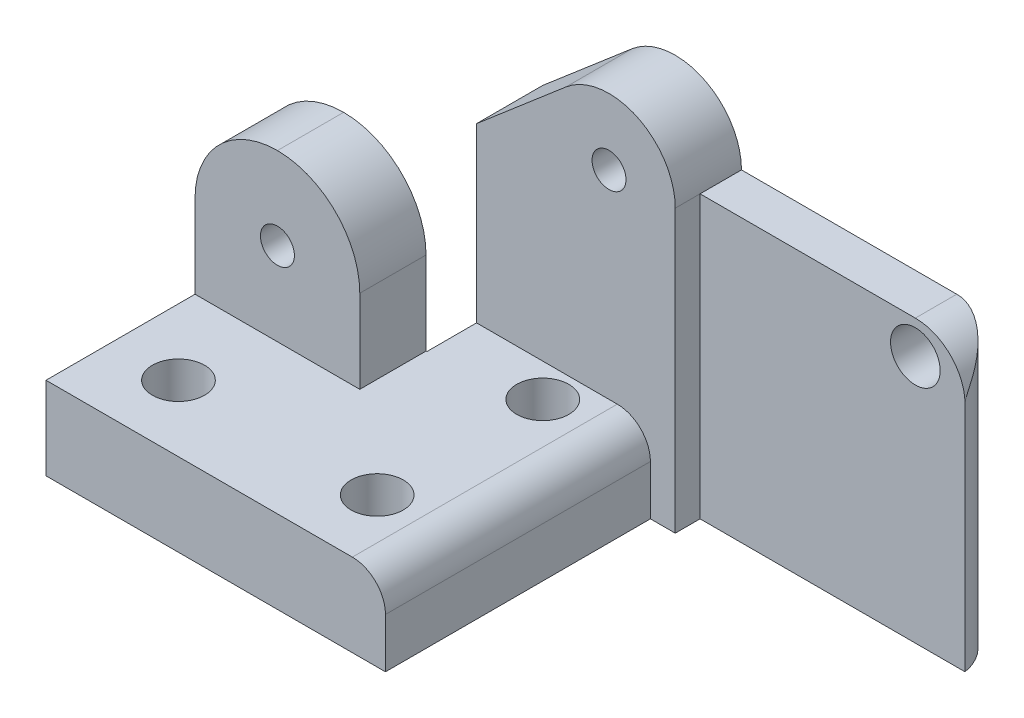
ISO-10303-21;
HEADER;
FILE_DESCRIPTION(('STEP AP214'),'2;1');
FILE_NAME('part.step','',(''),(''),'','','');
FILE_SCHEMA(('AUTOMOTIVE_DESIGN { 1 0 10303 214 1 1 1 1 }'));
ENDSEC;
DATA;
#1=APPLICATION_CONTEXT('core data for automotive mechanical design processes');
#2=APPLICATION_PROTOCOL_DEFINITION('international standard','automotive_design',2000,#1);
#3=PRODUCT_CONTEXT('',#1,'mechanical');
#4=PRODUCT('Part','Part','',(#3));
#5=PRODUCT_RELATED_PRODUCT_CATEGORY('part','',(#4));
#6=PRODUCT_DEFINITION_FORMATION('','',#4);
#7=PRODUCT_DEFINITION_CONTEXT('part definition',#1,'design');
#8=PRODUCT_DEFINITION('design','',#6,#7);
#9=PRODUCT_DEFINITION_SHAPE('','',#8);
#10=(LENGTH_UNIT() NAMED_UNIT(*) SI_UNIT(.MILLI.,.METRE.));
#11=(NAMED_UNIT(*) PLANE_ANGLE_UNIT() SI_UNIT($,.RADIAN.));
#12=(NAMED_UNIT(*) SI_UNIT($,.STERADIAN.) SOLID_ANGLE_UNIT());
#13=UNCERTAINTY_MEASURE_WITH_UNIT(LENGTH_MEASURE(1.E-05),#10,'distance_accuracy_value','');
#14=(GEOMETRIC_REPRESENTATION_CONTEXT(3) GLOBAL_UNCERTAINTY_ASSIGNED_CONTEXT((#13)) GLOBAL_UNIT_ASSIGNED_CONTEXT((#10,
#11,#12)) REPRESENTATION_CONTEXT('',''));
#15=CARTESIAN_POINT('',(0.,0.,0.));
#16=DIRECTION('',(0.,0.,1.));
#17=DIRECTION('',(1.,0.,0.));
#18=AXIS2_PLACEMENT_3D('',#15,#16,#17);
#19=CARTESIAN_POINT('',(16.,17.,-20.));
#20=DIRECTION('',(-1.,0.,0.));
#21=DIRECTION('',(0.,0.,-1.));
#22=AXIS2_PLACEMENT_3D('',#19,#20,#21);
#23=PLANE('',#22);
#24=DIRECTION('',(0.,1.,0.));
#25=VECTOR('',#24,1.);
#26=CARTESIAN_POINT('',(16.,0.,-17.5));
#27=LINE('',#26,#25);
#28=CARTESIAN_POINT('',(16.,0.,-17.5));
#29=VERTEX_POINT('',#28);
#30=CARTESIAN_POINT('',(16.,17.,-17.5));
#31=VERTEX_POINT('',#30);
#32=EDGE_CURVE('E211',#29,#31,#27,.T.);
#33=ORIENTED_EDGE('',*,*,#32,.T.);
#34=DIRECTION('',(0.,0.,1.));
#35=VECTOR('',#34,1.);
#36=CARTESIAN_POINT('',(16.,17.,-20.));
#37=LINE('',#36,#35);
#38=CARTESIAN_POINT('',(16.,17.,-16.));
#39=VERTEX_POINT('',#38);
#40=EDGE_CURVE('E444',#31,#39,#37,.T.);
#41=ORIENTED_EDGE('',*,*,#40,.T.);
#42=DIRECTION('',(0.,-1.,0.));
#43=VECTOR('',#42,1.);
#44=CARTESIAN_POINT('',(16.,5.,-16.));
#45=LINE('',#44,#43);
#46=CARTESIAN_POINT('',(16.,0.,-16.));
#47=VERTEX_POINT('',#46);
#48=EDGE_CURVE('E418',#39,#47,#45,.T.);
#49=ORIENTED_EDGE('',*,*,#48,.T.);
#50=DIRECTION('',(0.,0.,1.));
#51=VECTOR('',#50,1.);
#52=CARTESIAN_POINT('',(16.,0.,-20.));
#53=LINE('',#52,#51);
#54=EDGE_CURVE('E448',#29,#47,#53,.T.);
#55=ORIENTED_EDGE('',*,*,#54,.F.);
#56=EDGE_LOOP('',(#33,#41,#49,#55));
#57=FACE_BOUND('',#56,.T.);
#58=ADVANCED_FACE('F43',(#57),#23,.F.);
#59=CARTESIAN_POINT('',(12.,17.,-20.));
#60=DIRECTION('',(0.,0.,1.));
#61=DIRECTION('',(-1.,0.,0.));
#62=AXIS2_PLACEMENT_3D('',#59,#60,#61);
#63=PLANE('',#62);
#64=DIRECTION('',(0.,1.,0.));
#65=VECTOR('',#64,1.);
#66=CARTESIAN_POINT('',(29.0419601084502,17.,-20.));
#67=LINE('',#66,#65);
#68=CARTESIAN_POINT('',(29.0419601084502,0.,-20.));
#69=VERTEX_POINT('',#68);
#70=CARTESIAN_POINT('',(29.0419601084502,13.5005869984228,-20.));
#71=VERTEX_POINT('',#70);
#72=EDGE_CURVE('E184',#69,#71,#67,.T.);
#73=ORIENTED_EDGE('',*,*,#72,.F.);
#74=DIRECTION('',(1.,0.,0.));
#75=VECTOR('',#74,1.);
#76=CARTESIAN_POINT('',(16.,0.,-20.));
#77=LINE('',#76,#75);
#78=CARTESIAN_POINT('',(4.,0.,-20.));
#79=VERTEX_POINT('',#78);
#80=EDGE_CURVE('E430',#79,#69,#77,.T.);
#81=ORIENTED_EDGE('',*,*,#80,.F.);
#82=DIRECTION('',(0.,1.,0.));
#83=VECTOR('',#82,1.);
#84=CARTESIAN_POINT('',(4.,0.,-20.));
#85=LINE('',#84,#83);
#86=CARTESIAN_POINT('',(4.,15.4211646096066,-20.));
#87=VERTEX_POINT('',#86);
#88=EDGE_CURVE('E408',#79,#87,#85,.T.);
#89=ORIENTED_EDGE('',*,*,#88,.T.);
#90=DIRECTION('',(-0.759951494214413,-0.649979789256005,0.));
#91=VECTOR('',#90,1.);
#92=CARTESIAN_POINT('',(0.,12.,-20.));
#93=LINE('',#92,#91);
#94=CARTESIAN_POINT('',(9.40008084297598,20.0398059768577,-20.));
#95=VERTEX_POINT('',#94);
#96=EDGE_CURVE('E436',#95,#87,#93,.T.);
#97=ORIENTED_EDGE('',*,*,#96,.F.);
#98=CARTESIAN_POINT('',(12.,17.,-20.));
#99=DIRECTION('',(0.,0.,1.));
#100=DIRECTION('',(-1.,0.,0.));
#101=AXIS2_PLACEMENT_3D('',#98,#99,#100);
#102=CIRCLE('',#101,4.);
#103=CARTESIAN_POINT('',(16.,17.,-20.));
#104=VERTEX_POINT('',#103);
#105=EDGE_CURVE('E433',#104,#95,#102,.T.);
#106=ORIENTED_EDGE('',*,*,#105,.F.);
#107=DIRECTION('',(-1.,0.,0.));
#108=VECTOR('',#107,1.);
#109=CARTESIAN_POINT('',(32.,17.,-20.));
#110=LINE('',#109,#108);
#111=CARTESIAN_POINT('',(29.,17.,-20.));
#112=VERTEX_POINT('',#111);
#113=EDGE_CURVE('E325',#112,#104,#110,.T.);
#114=ORIENTED_EDGE('',*,*,#113,.F.);
#115=CARTESIAN_POINT('',(29.,14.,-20.));
#116=DIRECTION('',(0.,0.,-1.));
#117=DIRECTION('',(-1.,0.,0.));
#118=AXIS2_PLACEMENT_3D('',#115,#116,#117);
#119=CIRCLE('',#118,3.);
#120=CARTESIAN_POINT('',(29.0419601084502,16.9997065438637,-20.));
#121=VERTEX_POINT('',#120);
#122=EDGE_CURVE('E195',#121,#112,#119,.F.);
#123=ORIENTED_EDGE('',*,*,#122,.F.);
#124=CARTESIAN_POINT('',(29.0419601084502,16.4994130015772,-20.));
#125=VERTEX_POINT('',#124);
#126=EDGE_CURVE('E181',#125,#121,#67,.T.);
#127=ORIENTED_EDGE('',*,*,#126,.F.);
#128=CARTESIAN_POINT('',(29.,15.,-20.));
#129=DIRECTION('',(0.,0.,1.));
#130=DIRECTION('',(1.,0.,0.));
#131=AXIS2_PLACEMENT_3D('',#128,#129,#130);
#132=CIRCLE('',#131,1.5);
#133=EDGE_CURVE('E185',#125,#71,#132,.T.);
#134=ORIENTED_EDGE('',*,*,#133,.T.);
#135=EDGE_LOOP('',(#73,#81,#89,#97,#106,#114,#123,#127,#134));
#136=FACE_BOUND('',#135,.T.);
#137=CARTESIAN_POINT('',(12.,17.,-20.));
#138=DIRECTION('',(0.,0.,1.));
#139=DIRECTION('',(1.,0.,0.));
#140=AXIS2_PLACEMENT_3D('',#137,#138,#139);
#141=CIRCLE('',#140,1.025);
#142=CARTESIAN_POINT('',(13.025,17.,-20.));
#143=VERTEX_POINT('',#142);
#144=EDGE_CURVE('E336',#143,#143,#141,.T.);
#145=ORIENTED_EDGE('',*,*,#144,.T.);
#146=EDGE_LOOP('',(#145));
#147=FACE_BOUND('',#146,.T.);
#148=ADVANCED_FACE('F191',(#136,#147),#63,.F.);
#149=CARTESIAN_POINT('',(-6.,5.,-13.));
#150=DIRECTION('',(0.,0.,1.));
#151=DIRECTION('',(-1.,0.,0.));
#152=AXIS2_PLACEMENT_3D('',#149,#150,#151);
#153=PLANE('',#152);
#154=DIRECTION('',(0.,-1.,0.));
#155=VECTOR('',#154,1.);
#156=CARTESIAN_POINT('',(3.95,15.,-13.));
#157=LINE('',#156,#155);
#158=CARTESIAN_POINT('',(3.95,10.025,-13.));
#159=VERTEX_POINT('',#158);
#160=CARTESIAN_POINT('',(3.95,5.,-13.));
#161=VERTEX_POINT('',#160);
#162=EDGE_CURVE('E370',#159,#161,#157,.T.);
#163=ORIENTED_EDGE('',*,*,#162,.T.);
#164=DIRECTION('',(1.,0.,0.));
#165=VECTOR('',#164,1.);
#166=CARTESIAN_POINT('',(-6.,5.,-13.));
#167=LINE('',#166,#165);
#168=CARTESIAN_POINT('',(4.,5.,-13.));
#169=VERTEX_POINT('',#168);
#170=EDGE_CURVE('E400',#161,#169,#167,.T.);
#171=ORIENTED_EDGE('',*,*,#170,.T.);
#172=DIRECTION('',(0.,1.,0.));
#173=VECTOR('',#172,1.);
#174=CARTESIAN_POINT('',(4.,5.,-13.));
#175=LINE('',#174,#173);
#176=CARTESIAN_POINT('',(4.,0.,-13.));
#177=VERTEX_POINT('',#176);
#178=EDGE_CURVE('E389',#177,#169,#175,.T.);
#179=ORIENTED_EDGE('',*,*,#178,.F.);
#180=DIRECTION('',(1.,0.,0.));
#181=VECTOR('',#180,1.);
#182=CARTESIAN_POINT('',(-6.,0.,-13.));
#183=LINE('',#182,#181);
#184=CARTESIAN_POINT('',(-6.,0.,-13.));
#185=VERTEX_POINT('',#184);
#186=EDGE_CURVE('E405',#185,#177,#183,.T.);
#187=ORIENTED_EDGE('',*,*,#186,.F.);
#188=DIRECTION('',(0.,1.,0.));
#189=VECTOR('',#188,1.);
#190=CARTESIAN_POINT('',(-6.,5.,-13.));
#191=LINE('',#190,#189);
#192=CARTESIAN_POINT('',(-6.,10.025,-13.));
#193=VERTEX_POINT('',#192);
#194=EDGE_CURVE('E394',#185,#193,#191,.T.);
#195=ORIENTED_EDGE('',*,*,#194,.T.);
#196=CARTESIAN_POINT('',(-1.025,10.025,-13.));
#197=DIRECTION('',(0.,0.,-1.));
#198=DIRECTION('',(-1.,0.,0.));
#199=AXIS2_PLACEMENT_3D('',#196,#197,#198);
#200=CIRCLE('',#199,4.975);
#201=CARTESIAN_POINT('',(-1.025,15.,-13.));
#202=VERTEX_POINT('',#201);
#203=EDGE_CURVE('E466',#202,#193,#200,.F.);
#204=ORIENTED_EDGE('',*,*,#203,.F.);
#205=CARTESIAN_POINT('',(-1.025,10.025,-13.));
#206=DIRECTION('',(0.,0.,-1.));
#207=DIRECTION('',(-1.,0.,0.));
#208=AXIS2_PLACEMENT_3D('',#205,#206,#207);
#209=CIRCLE('',#208,4.975);
#210=EDGE_CURVE('E469',#159,#202,#209,.F.);
#211=ORIENTED_EDGE('',*,*,#210,.F.);
#212=EDGE_LOOP('',(#163,#171,#179,#187,#195,#204,#211));
#213=FACE_BOUND('',#212,.T.);
#214=CARTESIAN_POINT('',(-1.025,10.025,-13.));
#215=DIRECTION('',(0.,0.,1.));
#216=DIRECTION('',(1.,0.,0.));
#217=AXIS2_PLACEMENT_3D('',#214,#215,#216);
#218=CIRCLE('',#217,1.02499999999999);
#219=CARTESIAN_POINT('',(0.,10.025,-13.));
#220=VERTEX_POINT('',#219);
#221=EDGE_CURVE('E351',#220,#220,#218,.T.);
#222=ORIENTED_EDGE('',*,*,#221,.T.);
#223=EDGE_LOOP('',(#222));
#224=FACE_BOUND('',#223,.T.);
#225=ADVANCED_FACE('F256',(#213,#224),#153,.F.);
#226=CARTESIAN_POINT('',(-4.,5.,0.));
#227=DIRECTION('',(0.,-1.,0.));
#228=DIRECTION('',(0.,0.,1.));
#229=AXIS2_PLACEMENT_3D('',#226,#227,#228);
#230=PLANE('',#229);
#231=CARTESIAN_POINT('',(10.,5.,-14.));
#232=DIRECTION('',(0.,1.,0.));
#233=DIRECTION('',(0.,0.,1.));
#234=AXIS2_PLACEMENT_3D('',#231,#232,#233);
#235=CIRCLE('',#234,1.575);
#236=CARTESIAN_POINT('',(10.,5.,-12.425));
#237=VERTEX_POINT('',#236);
#238=EDGE_CURVE('E386',#237,#237,#235,.T.);
#239=ORIENTED_EDGE('',*,*,#238,.F.);
#240=EDGE_LOOP('',(#239));
#241=FACE_BOUND('',#240,.T.);
#242=CARTESIAN_POINT('',(10.,5.,-4.));
#243=DIRECTION('',(0.,1.,0.));
#244=DIRECTION('',(0.,0.,1.));
#245=AXIS2_PLACEMENT_3D('',#242,#243,#244);
#246=CIRCLE('',#245,1.575);
#247=CARTESIAN_POINT('',(10.,5.,-2.425));
#248=VERTEX_POINT('',#247);
#249=EDGE_CURVE('E382',#248,#248,#246,.T.);
#250=ORIENTED_EDGE('',*,*,#249,.F.);
#251=EDGE_LOOP('',(#250));
#252=FACE_BOUND('',#251,.T.);
#253=CARTESIAN_POINT('',(-2.,5.,-4.));
#254=DIRECTION('',(0.,1.,0.));
#255=DIRECTION('',(0.,0.,1.));
#256=AXIS2_PLACEMENT_3D('',#253,#254,#255);
#257=CIRCLE('',#256,1.575);
#258=CARTESIAN_POINT('',(-2.,5.,-2.425));
#259=VERTEX_POINT('',#258);
#260=EDGE_CURVE('E376',#259,#259,#257,.T.);
#261=ORIENTED_EDGE('',*,*,#260,.F.);
#262=EDGE_LOOP('',(#261));
#263=FACE_BOUND('',#262,.T.);
#264=DIRECTION('',(1.,0.,0.));
#265=VECTOR('',#264,1.);
#266=CARTESIAN_POINT('',(-4.,5.,-16.));
#267=LINE('',#266,#265);
#268=CARTESIAN_POINT('',(4.,5.,-16.));
#269=VERTEX_POINT('',#268);
#270=CARTESIAN_POINT('',(12.5,5.,-16.));
#271=VERTEX_POINT('',#270);
#272=EDGE_CURVE('E421',#269,#271,#267,.T.);
#273=ORIENTED_EDGE('',*,*,#272,.F.);
#274=DIRECTION('',(0.,0.,-1.));
#275=VECTOR('',#274,1.);
#276=CARTESIAN_POINT('',(4.,5.,0.));
#277=LINE('',#276,#275);
#278=EDGE_CURVE('E454',#169,#269,#277,.T.);
#279=ORIENTED_EDGE('',*,*,#278,.F.);
#280=ORIENTED_EDGE('',*,*,#170,.F.);
#281=DIRECTION('',(0.,0.,1.));
#282=VECTOR('',#281,1.);
#283=CARTESIAN_POINT('',(3.95,5.,-13.));
#284=LINE('',#283,#282);
#285=CARTESIAN_POINT('',(3.95,5.,-9.));
#286=VERTEX_POINT('',#285);
#287=EDGE_CURVE('E360',#161,#286,#284,.T.);
#288=ORIENTED_EDGE('',*,*,#287,.T.);
#289=DIRECTION('',(-1.,0.,0.));
#290=VECTOR('',#289,1.);
#291=CARTESIAN_POINT('',(-6.,5.,-9.));
#292=LINE('',#291,#290);
#293=CARTESIAN_POINT('',(-6.,5.,-9.));
#294=VERTEX_POINT('',#293);
#295=EDGE_CURVE('E363',#286,#294,#292,.T.);
#296=ORIENTED_EDGE('',*,*,#295,.T.);
#297=DIRECTION('',(0.,0.,1.));
#298=VECTOR('',#297,1.);
#299=CARTESIAN_POINT('',(-6.,5.,0.));
#300=LINE('',#299,#298);
#301=CARTESIAN_POINT('',(-6.,5.,0.));
#302=VERTEX_POINT('',#301);
#303=EDGE_CURVE('E397',#294,#302,#300,.T.);
#304=ORIENTED_EDGE('',*,*,#303,.T.);
#305=DIRECTION('',(-1.,0.,0.));
#306=VECTOR('',#305,1.);
#307=CARTESIAN_POINT('',(12.,5.,0.));
#308=LINE('',#307,#306);
#309=CARTESIAN_POINT('',(12.5,5.,0.));
#310=VERTEX_POINT('',#309);
#311=EDGE_CURVE('E451',#310,#302,#308,.T.);
#312=ORIENTED_EDGE('',*,*,#311,.F.);
#313=DIRECTION('',(0.,0.,-1.));
#314=VECTOR('',#313,1.);
#315=CARTESIAN_POINT('',(12.5,5.,0.));
#316=LINE('',#315,#314);
#317=EDGE_CURVE('E478',#271,#310,#316,.F.);
#318=ORIENTED_EDGE('',*,*,#317,.F.);
#319=EDGE_LOOP('',(#273,#279,#280,#288,#296,#304,#312,#318));
#320=FACE_BOUND('',#319,.T.);
#321=ADVANCED_FACE('F261',(#241,#252,#263,#320),#230,.F.);
#322=CARTESIAN_POINT('',(4.,0.,0.));
#323=DIRECTION('',(1.,0.,0.));
#324=DIRECTION('',(0.,0.,1.));
#325=AXIS2_PLACEMENT_3D('',#322,#323,#324);
#326=PLANE('',#325);
#327=ORIENTED_EDGE('',*,*,#178,.T.);
#328=ORIENTED_EDGE('',*,*,#278,.T.);
#329=DIRECTION('',(0.,1.,0.));
#330=VECTOR('',#329,1.);
#331=CARTESIAN_POINT('',(4.,5.,-16.));
#332=LINE('',#331,#330);
#333=CARTESIAN_POINT('',(4.,15.4211646096066,-16.));
#334=VERTEX_POINT('',#333);
#335=EDGE_CURVE('E414',#269,#334,#332,.T.);
#336=ORIENTED_EDGE('',*,*,#335,.T.);
#337=DIRECTION('',(0.,0.,-1.));
#338=VECTOR('',#337,1.);
#339=CARTESIAN_POINT('',(4.,15.4211646096066,0.));
#340=LINE('',#339,#338);
#341=EDGE_CURVE('E412',#334,#87,#340,.T.);
#342=ORIENTED_EDGE('',*,*,#341,.T.);
#343=ORIENTED_EDGE('',*,*,#88,.F.);
#344=DIRECTION('',(0.,0.,-1.));
#345=VECTOR('',#344,1.);
#346=CARTESIAN_POINT('',(4.,0.,0.));
#347=LINE('',#346,#345);
#348=EDGE_CURVE('E411',#177,#79,#347,.T.);
#349=ORIENTED_EDGE('',*,*,#348,.F.);
#350=EDGE_LOOP('',(#327,#328,#336,#342,#343,#349));
#351=FACE_BOUND('',#350,.T.);
#352=ADVANCED_FACE('F237',(#351),#326,.F.);
#353=CARTESIAN_POINT('',(16.,0.,-20.));
#354=DIRECTION('',(0.,1.,0.));
#355=DIRECTION('',(0.,0.,-1.));
#356=AXIS2_PLACEMENT_3D('',#353,#354,#355);
#357=PLANE('',#356);
#358=CARTESIAN_POINT('',(-2.,0.,-4.));
#359=DIRECTION('',(0.,1.,0.));
#360=DIRECTION('',(0.,0.,1.));
#361=AXIS2_PLACEMENT_3D('',#358,#359,#360);
#362=CIRCLE('',#361,1.575);
#363=CARTESIAN_POINT('',(-2.,0.,-2.425));
#364=VERTEX_POINT('',#363);
#365=EDGE_CURVE('E373',#364,#364,#362,.T.);
#366=ORIENTED_EDGE('',*,*,#365,.T.);
#367=EDGE_LOOP('',(#366));
#368=FACE_BOUND('',#367,.T.);
#369=CARTESIAN_POINT('',(10.,0.,-4.));
#370=DIRECTION('',(0.,1.,0.));
#371=DIRECTION('',(0.,0.,1.));
#372=AXIS2_PLACEMENT_3D('',#369,#370,#371);
#373=CIRCLE('',#372,1.575);
#374=CARTESIAN_POINT('',(10.,0.,-2.425));
#375=VERTEX_POINT('',#374);
#376=EDGE_CURVE('E379',#375,#375,#373,.T.);
#377=ORIENTED_EDGE('',*,*,#376,.T.);
#378=EDGE_LOOP('',(#377));
#379=FACE_BOUND('',#378,.T.);
#380=CARTESIAN_POINT('',(10.,0.,-14.));
#381=DIRECTION('',(0.,1.,0.));
#382=DIRECTION('',(0.,0.,1.));
#383=AXIS2_PLACEMENT_3D('',#380,#381,#382);
#384=CIRCLE('',#383,1.575);
#385=CARTESIAN_POINT('',(10.,0.,-12.425));
#386=VERTEX_POINT('',#385);
#387=EDGE_CURVE('E383',#386,#386,#384,.T.);
#388=ORIENTED_EDGE('',*,*,#387,.T.);
#389=EDGE_LOOP('',(#388));
#390=FACE_BOUND('',#389,.T.);
#391=DIRECTION('',(-1.,0.,0.));
#392=VECTOR('',#391,1.);
#393=CARTESIAN_POINT('',(32.,0.,-17.5));
#394=LINE('',#393,#392);
#395=CARTESIAN_POINT('',(32.,0.,-17.5));
#396=VERTEX_POINT('',#395);
#397=EDGE_CURVE('E323',#396,#29,#394,.T.);
#398=ORIENTED_EDGE('',*,*,#397,.T.);
#399=ORIENTED_EDGE('',*,*,#54,.T.);
#400=DIRECTION('',(1.,0.,0.));
#401=VECTOR('',#400,1.);
#402=CARTESIAN_POINT('',(16.,0.,-16.));
#403=LINE('',#402,#401);
#404=CARTESIAN_POINT('',(14.5,0.,-16.));
#405=VERTEX_POINT('',#404);
#406=EDGE_CURVE('E345',#405,#47,#403,.T.);
#407=ORIENTED_EDGE('',*,*,#406,.F.);
#408=DIRECTION('',(0.,0.,-1.));
#409=VECTOR('',#408,1.);
#410=CARTESIAN_POINT('',(14.5,0.,0.));
#411=LINE('',#410,#409);
#412=CARTESIAN_POINT('',(14.5,0.,0.));
#413=VERTEX_POINT('',#412);
#414=EDGE_CURVE('E342',#413,#405,#411,.T.);
#415=ORIENTED_EDGE('',*,*,#414,.F.);
#416=DIRECTION('',(1.,0.,0.));
#417=VECTOR('',#416,1.);
#418=CARTESIAN_POINT('',(16.,0.,0.));
#419=LINE('',#418,#417);
#420=CARTESIAN_POINT('',(-6.,0.,0.));
#421=VERTEX_POINT('',#420);
#422=EDGE_CURVE('E429',#421,#413,#419,.T.);
#423=ORIENTED_EDGE('',*,*,#422,.F.);
#424=DIRECTION('',(0.,0.,-1.));
#425=VECTOR('',#424,1.);
#426=CARTESIAN_POINT('',(-6.,0.,-13.));
#427=LINE('',#426,#425);
#428=EDGE_CURVE('E392',#421,#185,#427,.T.);
#429=ORIENTED_EDGE('',*,*,#428,.T.);
#430=ORIENTED_EDGE('',*,*,#186,.T.);
#431=ORIENTED_EDGE('',*,*,#348,.T.);
#432=ORIENTED_EDGE('',*,*,#80,.T.);
#433=CARTESIAN_POINT('',(29.0419601084502,0.,-17.));
#434=DIRECTION('',(0.,-1.,0.));
#435=DIRECTION('',(0.,0.,-1.));
#436=AXIS2_PLACEMENT_3D('',#433,#434,#435);
#437=CIRCLE('',#436,3.);
#438=EDGE_CURVE('E57',#396,#69,#437,.F.);
#439=ORIENTED_EDGE('',*,*,#438,.F.);
#440=EDGE_LOOP('',(#398,#399,#407,#415,#423,#429,#430,#431,#432,#439));
#441=FACE_BOUND('',#440,.T.);
#442=ADVANCED_FACE('F233',(#368,#379,#390,#441),#357,.F.);
#443=CARTESIAN_POINT('',(12.,17.,-20.));
#444=DIRECTION('',(0.,0.,1.));
#445=DIRECTION('',(-1.,0.,0.));
#446=AXIS2_PLACEMENT_3D('',#443,#444,#445);
#447=CYLINDRICAL_SURFACE('',#446,4.);
#448=EDGE_CURVE('E445',#104,#31,#37,.T.);
#449=ORIENTED_EDGE('',*,*,#448,.F.);
#450=ORIENTED_EDGE('',*,*,#105,.T.);
#451=DIRECTION('',(0.,0.,1.));
#452=VECTOR('',#451,1.);
#453=CARTESIAN_POINT('',(9.40008084297598,20.0398059768577,-20.));
#454=LINE('',#453,#452);
#455=CARTESIAN_POINT('',(9.40008084297598,20.0398059768577,-16.));
#456=VERTEX_POINT('',#455);
#457=EDGE_CURVE('E439',#95,#456,#454,.T.);
#458=ORIENTED_EDGE('',*,*,#457,.T.);
#459=CARTESIAN_POINT('',(12.,17.,-16.));
#460=DIRECTION('',(0.,0.,1.));
#461=DIRECTION('',(1.,0.,0.));
#462=AXIS2_PLACEMENT_3D('',#459,#460,#461);
#463=CIRCLE('',#462,4.);
#464=EDGE_CURVE('E426',#39,#456,#463,.T.);
#465=ORIENTED_EDGE('',*,*,#464,.F.);
#466=ORIENTED_EDGE('',*,*,#40,.F.);
#467=EDGE_LOOP('',(#449,#450,#458,#465,#466));
#468=FACE_BOUND('',#467,.T.);
#469=ADVANCED_FACE('F236',(#468),#447,.T.);
#470=CARTESIAN_POINT('',(0.,12.,-20.));
#471=DIRECTION('',(0.649979789256005,-0.759951494214413,0.));
#472=DIRECTION('',(0.759951494214413,0.649979789256005,0.));
#473=AXIS2_PLACEMENT_3D('',#470,#471,#472);
#474=PLANE('',#473);
#475=DIRECTION('',(-0.759951494214413,-0.649979789256005,0.));
#476=VECTOR('',#475,1.);
#477=CARTESIAN_POINT('',(0.,12.,-16.));
#478=LINE('',#477,#476);
#479=EDGE_CURVE('E424',#456,#334,#478,.T.);
#480=ORIENTED_EDGE('',*,*,#479,.F.);
#481=ORIENTED_EDGE('',*,*,#457,.F.);
#482=ORIENTED_EDGE('',*,*,#96,.T.);
#483=ORIENTED_EDGE('',*,*,#341,.F.);
#484=EDGE_LOOP('',(#480,#481,#482,#483));
#485=FACE_BOUND('',#484,.T.);
#486=ADVANCED_FACE('F244',(#485),#474,.F.);
#487=CARTESIAN_POINT('',(12.,17.,0.));
#488=DIRECTION('',(0.,0.,1.));
#489=DIRECTION('',(-1.,0.,0.));
#490=AXIS2_PLACEMENT_3D('',#487,#488,#489);
#491=PLANE('',#490);
#492=ORIENTED_EDGE('',*,*,#311,.T.);
#493=DIRECTION('',(0.,-1.,0.));
#494=VECTOR('',#493,1.);
#495=CARTESIAN_POINT('',(-6.,0.,0.));
#496=LINE('',#495,#494);
#497=EDGE_CURVE('E390',#302,#421,#496,.T.);
#498=ORIENTED_EDGE('',*,*,#497,.T.);
#499=ORIENTED_EDGE('',*,*,#422,.T.);
#500=DIRECTION('',(0.,1.,0.));
#501=VECTOR('',#500,1.);
#502=CARTESIAN_POINT('',(14.5,0.,0.));
#503=LINE('',#502,#501);
#504=CARTESIAN_POINT('',(14.5,3.,0.));
#505=VERTEX_POINT('',#504);
#506=EDGE_CURVE('E347',#413,#505,#503,.T.);
#507=ORIENTED_EDGE('',*,*,#506,.T.);
#508=CARTESIAN_POINT('',(12.5,3.,0.));
#509=DIRECTION('',(0.,0.,-1.));
#510=DIRECTION('',(-1.,0.,0.));
#511=AXIS2_PLACEMENT_3D('',#508,#509,#510);
#512=CIRCLE('',#511,2.);
#513=EDGE_CURVE('E198',#310,#505,#512,.T.);
#514=ORIENTED_EDGE('',*,*,#513,.F.);
#515=EDGE_LOOP('',(#492,#498,#499,#507,#514));
#516=FACE_BOUND('',#515,.T.);
#517=ADVANCED_FACE('F248',(#516),#491,.T.);
#518=CARTESIAN_POINT('',(-4.,5.,-16.));
#519=DIRECTION('',(0.,0.,-1.));
#520=DIRECTION('',(1.,0.,0.));
#521=AXIS2_PLACEMENT_3D('',#518,#519,#520);
#522=PLANE('',#521);
#523=CARTESIAN_POINT('',(12.,17.,-16.));
#524=DIRECTION('',(0.,0.,1.));
#525=DIRECTION('',(1.,0.,0.));
#526=AXIS2_PLACEMENT_3D('',#523,#524,#525);
#527=CIRCLE('',#526,1.025);
#528=CARTESIAN_POINT('',(13.025,17.,-16.));
#529=VERTEX_POINT('',#528);
#530=EDGE_CURVE('E339',#529,#529,#527,.T.);
#531=ORIENTED_EDGE('',*,*,#530,.F.);
#532=EDGE_LOOP('',(#531));
#533=FACE_BOUND('',#532,.T.);
#534=ORIENTED_EDGE('',*,*,#272,.T.);
#535=CARTESIAN_POINT('',(12.5,3.,-16.));
#536=DIRECTION('',(0.,0.,1.));
#537=DIRECTION('',(1.,0.,0.));
#538=AXIS2_PLACEMENT_3D('',#535,#536,#537);
#539=CIRCLE('',#538,2.);
#540=CARTESIAN_POINT('',(14.5,3.,-16.));
#541=VERTEX_POINT('',#540);
#542=EDGE_CURVE('E196',#541,#271,#539,.T.);
#543=ORIENTED_EDGE('',*,*,#542,.F.);
#544=DIRECTION('',(0.,1.,0.));
#545=VECTOR('',#544,1.);
#546=CARTESIAN_POINT('',(14.5,0.,-16.));
#547=LINE('',#546,#545);
#548=EDGE_CURVE('E348',#405,#541,#547,.T.);
#549=ORIENTED_EDGE('',*,*,#548,.F.);
#550=ORIENTED_EDGE('',*,*,#406,.T.);
#551=ORIENTED_EDGE('',*,*,#48,.F.);
#552=ORIENTED_EDGE('',*,*,#464,.T.);
#553=ORIENTED_EDGE('',*,*,#479,.T.);
#554=ORIENTED_EDGE('',*,*,#335,.F.);
#555=EDGE_LOOP('',(#534,#543,#549,#550,#551,#552,#553,#554));
#556=FACE_BOUND('',#555,.T.);
#557=ADVANCED_FACE('F252',(#533,#556),#522,.F.);
#558=CARTESIAN_POINT('',(-6.,0.,0.));
#559=DIRECTION('',(1.,0.,0.));
#560=DIRECTION('',(0.,0.,1.));
#561=AXIS2_PLACEMENT_3D('',#558,#559,#560);
#562=PLANE('',#561);
#563=ORIENTED_EDGE('',*,*,#194,.F.);
#564=ORIENTED_EDGE('',*,*,#428,.F.);
#565=ORIENTED_EDGE('',*,*,#497,.F.);
#566=ORIENTED_EDGE('',*,*,#303,.F.);
#567=DIRECTION('',(0.,-1.,0.));
#568=VECTOR('',#567,1.);
#569=CARTESIAN_POINT('',(-6.,15.,-9.));
#570=LINE('',#569,#568);
#571=CARTESIAN_POINT('',(-6.,10.025,-9.));
#572=VERTEX_POINT('',#571);
#573=EDGE_CURVE('E366',#572,#294,#570,.T.);
#574=ORIENTED_EDGE('',*,*,#573,.F.);
#575=DIRECTION('',(0.,0.,-1.));
#576=VECTOR('',#575,1.);
#577=CARTESIAN_POINT('',(-6.,10.025,0.));
#578=LINE('',#577,#576);
#579=EDGE_CURVE('E472',#193,#572,#578,.F.);
#580=ORIENTED_EDGE('',*,*,#579,.F.);
#581=EDGE_LOOP('',(#563,#564,#565,#566,#574,#580));
#582=FACE_BOUND('',#581,.T.);
#583=ADVANCED_FACE('F259',(#582),#562,.F.);
#584=CARTESIAN_POINT('',(10.,0.,-14.));
#585=DIRECTION('',(0.,-1.,0.));
#586=DIRECTION('',(0.,0.,1.));
#587=AXIS2_PLACEMENT_3D('',#584,#585,#586);
#588=CYLINDRICAL_SURFACE('',#587,1.575);
#589=ORIENTED_EDGE('',*,*,#387,.F.);
#590=EDGE_LOOP('',(#589));
#591=FACE_BOUND('',#590,.T.);
#592=ORIENTED_EDGE('',*,*,#238,.T.);
#593=EDGE_LOOP('',(#592));
#594=FACE_BOUND('',#593,.T.);
#595=ADVANCED_FACE('F273',(#591,#594),#588,.F.);
#596=CARTESIAN_POINT('',(10.,0.,-4.));
#597=DIRECTION('',(0.,-1.,0.));
#598=DIRECTION('',(0.,0.,1.));
#599=AXIS2_PLACEMENT_3D('',#596,#597,#598);
#600=CYLINDRICAL_SURFACE('',#599,1.575);
#601=ORIENTED_EDGE('',*,*,#376,.F.);
#602=EDGE_LOOP('',(#601));
#603=FACE_BOUND('',#602,.T.);
#604=ORIENTED_EDGE('',*,*,#249,.T.);
#605=EDGE_LOOP('',(#604));
#606=FACE_BOUND('',#605,.T.);
#607=ADVANCED_FACE('F277',(#603,#606),#600,.F.);
#608=CARTESIAN_POINT('',(-2.,0.,-4.));
#609=DIRECTION('',(0.,-1.,0.));
#610=DIRECTION('',(0.,0.,1.));
#611=AXIS2_PLACEMENT_3D('',#608,#609,#610);
#612=CYLINDRICAL_SURFACE('',#611,1.575);
#613=ORIENTED_EDGE('',*,*,#365,.F.);
#614=EDGE_LOOP('',(#613));
#615=FACE_BOUND('',#614,.T.);
#616=ORIENTED_EDGE('',*,*,#260,.T.);
#617=EDGE_LOOP('',(#616));
#618=FACE_BOUND('',#617,.T.);
#619=ADVANCED_FACE('F281',(#615,#618),#612,.F.);
#620=CARTESIAN_POINT('',(3.95,15.,-13.));
#621=DIRECTION('',(-1.,0.,0.));
#622=DIRECTION('',(0.,0.,-1.));
#623=AXIS2_PLACEMENT_3D('',#620,#621,#622);
#624=PLANE('',#623);
#625=DIRECTION('',(0.,-1.,0.));
#626=VECTOR('',#625,1.);
#627=CARTESIAN_POINT('',(3.95,15.,-9.));
#628=LINE('',#627,#626);
#629=CARTESIAN_POINT('',(3.95,10.025,-9.));
#630=VERTEX_POINT('',#629);
#631=EDGE_CURVE('E368',#630,#286,#628,.T.);
#632=ORIENTED_EDGE('',*,*,#631,.T.);
#633=ORIENTED_EDGE('',*,*,#287,.F.);
#634=ORIENTED_EDGE('',*,*,#162,.F.);
#635=DIRECTION('',(0.,0.,1.));
#636=VECTOR('',#635,1.);
#637=CARTESIAN_POINT('',(3.95,10.025,-13.));
#638=LINE('',#637,#636);
#639=EDGE_CURVE('E464',#630,#159,#638,.F.);
#640=ORIENTED_EDGE('',*,*,#639,.F.);
#641=EDGE_LOOP('',(#632,#633,#634,#640));
#642=FACE_BOUND('',#641,.T.);
#643=ADVANCED_FACE('F285',(#642),#624,.F.);
#644=CARTESIAN_POINT('',(-6.,15.,-9.));
#645=DIRECTION('',(0.,0.,-1.));
#646=DIRECTION('',(0.,-1.,0.));
#647=AXIS2_PLACEMENT_3D('',#644,#645,#646);
#648=PLANE('',#647);
#649=CARTESIAN_POINT('',(-1.025,10.025,-9.));
#650=DIRECTION('',(0.,0.,1.));
#651=DIRECTION('',(0.,-1.,0.));
#652=AXIS2_PLACEMENT_3D('',#649,#650,#651);
#653=CIRCLE('',#652,1.02499999999999);
#654=CARTESIAN_POINT('',(-1.025,9.00000000000001,-9.));
#655=VERTEX_POINT('',#654);
#656=EDGE_CURVE('E356',#655,#655,#653,.T.);
#657=ORIENTED_EDGE('',*,*,#656,.F.);
#658=EDGE_LOOP('',(#657));
#659=FACE_BOUND('',#658,.T.);
#660=CARTESIAN_POINT('',(-1.025,10.025,-9.));
#661=DIRECTION('',(0.,0.,1.));
#662=DIRECTION('',(0.,-1.,0.));
#663=AXIS2_PLACEMENT_3D('',#660,#661,#662);
#664=CIRCLE('',#663,4.975);
#665=CARTESIAN_POINT('',(-1.025,15.,-9.));
#666=VERTEX_POINT('',#665);
#667=EDGE_CURVE('E457',#572,#666,#664,.F.);
#668=ORIENTED_EDGE('',*,*,#667,.F.);
#669=ORIENTED_EDGE('',*,*,#573,.T.);
#670=ORIENTED_EDGE('',*,*,#295,.F.);
#671=ORIENTED_EDGE('',*,*,#631,.F.);
#672=CARTESIAN_POINT('',(-1.025,10.025,-9.));
#673=DIRECTION('',(0.,0.,1.));
#674=DIRECTION('',(0.,-1.,0.));
#675=AXIS2_PLACEMENT_3D('',#672,#673,#674);
#676=CIRCLE('',#675,4.975);
#677=EDGE_CURVE('E462',#666,#630,#676,.F.);
#678=ORIENTED_EDGE('',*,*,#677,.F.);
#679=EDGE_LOOP('',(#668,#669,#670,#671,#678));
#680=FACE_BOUND('',#679,.T.);
#681=ADVANCED_FACE('F227',(#659,#680),#648,.F.);
#682=CARTESIAN_POINT('',(-1.025,10.025,0.));
#683=DIRECTION('',(0.,0.,-1.));
#684=DIRECTION('',(1.,0.,0.));
#685=AXIS2_PLACEMENT_3D('',#682,#683,#684);
#686=CYLINDRICAL_SURFACE('',#685,4.975);
#687=ORIENTED_EDGE('',*,*,#579,.T.);
#688=ORIENTED_EDGE('',*,*,#667,.T.);
#689=DIRECTION('',(0.,0.,-1.));
#690=VECTOR('',#689,1.);
#691=CARTESIAN_POINT('',(-1.025,15.,0.));
#692=LINE('',#691,#690);
#693=EDGE_CURVE('E359',#666,#202,#692,.T.);
#694=ORIENTED_EDGE('',*,*,#693,.T.);
#695=ORIENTED_EDGE('',*,*,#203,.T.);
#696=EDGE_LOOP('',(#687,#688,#694,#695));
#697=FACE_BOUND('',#696,.T.);
#698=ADVANCED_FACE('F223',(#697),#686,.T.);
#699=CARTESIAN_POINT('',(-1.025,10.025,0.));
#700=DIRECTION('',(0.,0.,1.));
#701=DIRECTION('',(-1.,0.,0.));
#702=AXIS2_PLACEMENT_3D('',#699,#700,#701);
#703=CYLINDRICAL_SURFACE('',#702,4.975);
#704=ORIENTED_EDGE('',*,*,#210,.T.);
#705=ORIENTED_EDGE('',*,*,#693,.F.);
#706=ORIENTED_EDGE('',*,*,#677,.T.);
#707=ORIENTED_EDGE('',*,*,#639,.T.);
#708=EDGE_LOOP('',(#704,#705,#706,#707));
#709=FACE_BOUND('',#708,.T.);
#710=ADVANCED_FACE('F226',(#709),#703,.T.);
#711=CARTESIAN_POINT('',(-1.025,10.025,-13.));
#712=DIRECTION('',(0.,0.,-1.));
#713=DIRECTION('',(1.,0.,0.));
#714=AXIS2_PLACEMENT_3D('',#711,#712,#713);
#715=CYLINDRICAL_SURFACE('',#714,1.02499999999999);
#716=ORIENTED_EDGE('',*,*,#656,.T.);
#717=EDGE_LOOP('',(#716));
#718=FACE_BOUND('',#717,.T.);
#719=ORIENTED_EDGE('',*,*,#221,.F.);
#720=EDGE_LOOP('',(#719));
#721=FACE_BOUND('',#720,.T.);
#722=ADVANCED_FACE('F231',(#718,#721),#715,.F.);
#723=CARTESIAN_POINT('',(14.5,0.,0.));
#724=DIRECTION('',(-1.,0.,0.));
#725=DIRECTION('',(0.,0.,-1.));
#726=AXIS2_PLACEMENT_3D('',#723,#724,#725);
#727=PLANE('',#726);
#728=ORIENTED_EDGE('',*,*,#506,.F.);
#729=ORIENTED_EDGE('',*,*,#414,.T.);
#730=ORIENTED_EDGE('',*,*,#548,.T.);
#731=DIRECTION('',(0.,0.,-1.));
#732=VECTOR('',#731,1.);
#733=CARTESIAN_POINT('',(14.5,3.,0.));
#734=LINE('',#733,#732);
#735=EDGE_CURVE('E475',#505,#541,#734,.T.);
#736=ORIENTED_EDGE('',*,*,#735,.F.);
#737=EDGE_LOOP('',(#728,#729,#730,#736));
#738=FACE_BOUND('',#737,.T.);
#739=ADVANCED_FACE('F221',(#738),#727,.F.);
#740=CARTESIAN_POINT('',(12.5,3.,0.));
#741=DIRECTION('',(0.,0.,-1.));
#742=DIRECTION('',(0.,-1.,0.));
#743=AXIS2_PLACEMENT_3D('',#740,#741,#742);
#744=CYLINDRICAL_SURFACE('',#743,2.);
#745=ORIENTED_EDGE('',*,*,#513,.T.);
#746=ORIENTED_EDGE('',*,*,#735,.T.);
#747=ORIENTED_EDGE('',*,*,#542,.T.);
#748=ORIENTED_EDGE('',*,*,#317,.T.);
#749=EDGE_LOOP('',(#745,#746,#747,#748));
#750=FACE_BOUND('',#749,.T.);
#751=ADVANCED_FACE('F216',(#750),#744,.T.);
#752=CARTESIAN_POINT('',(12.,17.,-20.));
#753=DIRECTION('',(0.,0.,-1.));
#754=DIRECTION('',(1.,0.,0.));
#755=AXIS2_PLACEMENT_3D('',#752,#753,#754);
#756=CYLINDRICAL_SURFACE('',#755,1.025);
#757=ORIENTED_EDGE('',*,*,#530,.T.);
#758=EDGE_LOOP('',(#757));
#759=FACE_BOUND('',#758,.T.);
#760=ORIENTED_EDGE('',*,*,#144,.F.);
#761=EDGE_LOOP('',(#760));
#762=FACE_BOUND('',#761,.T.);
#763=ADVANCED_FACE('F220',(#759,#762),#756,.F.);
#764=CARTESIAN_POINT('',(32.,0.,-17.5));
#765=DIRECTION('',(0.,0.,-1.));
#766=DIRECTION('',(1.,0.,0.));
#767=AXIS2_PLACEMENT_3D('',#764,#765,#766);
#768=PLANE('',#767);
#769=CARTESIAN_POINT('',(29.,15.,-17.5));
#770=DIRECTION('',(0.,0.,1.));
#771=DIRECTION('',(1.,0.,0.));
#772=AXIS2_PLACEMENT_3D('',#769,#770,#771);
#773=CIRCLE('',#772,1.5);
#774=CARTESIAN_POINT('',(30.5,15.,-17.5));
#775=VERTEX_POINT('',#774);
#776=EDGE_CURVE('E189',#775,#775,#773,.T.);
#777=ORIENTED_EDGE('',*,*,#776,.F.);
#778=EDGE_LOOP('',(#777));
#779=FACE_BOUND('',#778,.T.);
#780=DIRECTION('',(-1.,0.,0.));
#781=VECTOR('',#780,1.);
#782=CARTESIAN_POINT('',(32.,17.,-17.5));
#783=LINE('',#782,#781);
#784=CARTESIAN_POINT('',(29.,17.,-17.5));
#785=VERTEX_POINT('',#784);
#786=EDGE_CURVE('E328',#785,#31,#783,.T.);
#787=ORIENTED_EDGE('',*,*,#786,.T.);
#788=ORIENTED_EDGE('',*,*,#32,.F.);
#789=ORIENTED_EDGE('',*,*,#397,.F.);
#790=DIRECTION('',(0.,1.,0.));
#791=VECTOR('',#790,1.);
#792=CARTESIAN_POINT('',(32.,0.,-17.5));
#793=LINE('',#792,#791);
#794=CARTESIAN_POINT('',(32.,14.,-17.5));
#795=VERTEX_POINT('',#794);
#796=EDGE_CURVE('E321',#396,#795,#793,.T.);
#797=ORIENTED_EDGE('',*,*,#796,.T.);
#798=CARTESIAN_POINT('',(29.,14.,-17.5));
#799=DIRECTION('',(0.,0.,1.));
#800=DIRECTION('',(1.,0.,0.));
#801=AXIS2_PLACEMENT_3D('',#798,#799,#800);
#802=CIRCLE('',#801,3.);
#803=EDGE_CURVE('E205',#785,#795,#802,.F.);
#804=ORIENTED_EDGE('',*,*,#803,.F.);
#805=EDGE_LOOP('',(#787,#788,#789,#797,#804));
#806=FACE_BOUND('',#805,.T.);
#807=ADVANCED_FACE('F301',(#779,#806),#768,.F.);
#808=CARTESIAN_POINT('',(32.,17.,-20.));
#809=DIRECTION('',(0.,-1.,0.));
#810=DIRECTION('',(0.,0.,1.));
#811=AXIS2_PLACEMENT_3D('',#808,#809,#810);
#812=PLANE('',#811);
#813=ORIENTED_EDGE('',*,*,#113,.T.);
#814=ORIENTED_EDGE('',*,*,#448,.T.);
#815=ORIENTED_EDGE('',*,*,#786,.F.);
#816=DIRECTION('',(0.,0.,-1.));
#817=VECTOR('',#816,1.);
#818=CARTESIAN_POINT('',(29.,17.,-20.));
#819=LINE('',#818,#817);
#820=EDGE_CURVE('E203',#112,#785,#819,.F.);
#821=ORIENTED_EDGE('',*,*,#820,.F.);
#822=EDGE_LOOP('',(#813,#814,#815,#821));
#823=FACE_BOUND('',#822,.T.);
#824=ADVANCED_FACE('F215',(#823),#812,.F.);
#825=CARTESIAN_POINT('',(29.0419601084502,0.,-17.));
#826=DIRECTION('',(0.,1.,0.));
#827=DIRECTION('',(0.,0.,-1.));
#828=AXIS2_PLACEMENT_3D('',#825,#826,#827);
#829=CYLINDRICAL_SURFACE('',#828,3.);
#830=CARTESIAN_POINT('',(29.0419601084502,13.5005869984228,-20.));
#831=CARTESIAN_POINT('',(29.0816684423591,13.5016960949229,-20.0000040800019));
#832=CARTESIAN_POINT('',(29.1213109898105,13.5043872422636,-19.9992107793967));
#833=CARTESIAN_POINT('',(29.2001823914317,13.5128888338567,-19.9960839585592));
#834=CARTESIAN_POINT('',(29.2394114131522,13.5186979610258,-19.9937510885697));
#835=CARTESIAN_POINT('',(29.3556868171668,13.5406594763846,-19.9845569526463));
#836=CARTESIAN_POINT('',(29.4317546481174,13.561359055129,-19.9754989522466));
#837=CARTESIAN_POINT('',(29.5789126316082,13.6140079380113,-19.9524973233155));
#838=CARTESIAN_POINT('',(29.6500087562449,13.6459434570834,-19.9385596815839));
#839=CARTESIAN_POINT('',(29.7858866463305,13.7200093896902,-19.9071364385333));
#840=CARTESIAN_POINT('',(29.85066178291,13.7621503479226,-19.8896471705589));
#841=CARTESIAN_POINT('',(29.976354729313,13.8583470385947,-19.8515748758131));
#842=CARTESIAN_POINT('',(30.0367998571055,13.9129706596674,-19.8308685069415));
#843=CARTESIAN_POINT('',(30.1480873725339,14.0312404895169,-19.7892682917078));
#844=CARTESIAN_POINT('',(30.1989240132468,14.0948920584069,-19.7683743409272));
#845=CARTESIAN_POINT('',(30.2930351570933,14.2347275140955,-19.7272021123125));
#846=CARTESIAN_POINT('',(30.3355432209304,14.311473756559,-19.7070664208199));
#847=CARTESIAN_POINT('',(30.4068073734831,14.4721738097447,-19.6718505616503));
#848=CARTESIAN_POINT('',(30.4355751699955,14.5561214121218,-19.656766093219));
#849=CARTESIAN_POINT('',(30.4765300281594,14.7229908047385,-19.6348660935569));
#850=CARTESIAN_POINT('',(30.489697735025,14.8056053868309,-19.6275648102147));
#851=CARTESIAN_POINT('',(30.5020602304122,14.9721688408206,-19.6207186820435));
#852=CARTESIAN_POINT('',(30.5012653026145,15.0561166852247,-19.6211681286865));
#853=CARTESIAN_POINT('',(30.4866165853458,15.2133977359422,-19.6292614619825));
#854=CARTESIAN_POINT('',(30.4741639300876,15.2869085018025,-19.6361332994956));
#855=CARTESIAN_POINT('',(30.4387569085536,15.4306513837214,-19.6550627360958));
#856=CARTESIAN_POINT('',(30.4157994437204,15.500882525663,-19.6671218651925));
#857=CARTESIAN_POINT('',(30.3591811825841,15.6390692802591,-19.6955448904231));
#858=CARTESIAN_POINT('',(30.3251568711052,15.7068454463198,-19.7120511449159));
#859=CARTESIAN_POINT('',(30.2476507741785,15.8360935757402,-19.7473846654023));
#860=CARTESIAN_POINT('',(30.2041643343381,15.897562414569,-19.7662130716737));
#861=CARTESIAN_POINT('',(30.1029137941728,16.0201105693121,-19.8067219953231));
#862=CARTESIAN_POINT('',(30.0440669469675,16.0802749161157,-19.8284754847248));
#863=CARTESIAN_POINT('',(29.9167884975235,16.1901977054698,-19.8703940667259));
#864=CARTESIAN_POINT('',(29.848352321852,16.2399511543595,-19.8905583941951));
#865=CARTESIAN_POINT('',(29.7013706666757,16.3287768910217,-19.9276394469186));
#866=CARTESIAN_POINT('',(29.6226031390932,16.3675266240589,-19.9444544704813));
#867=CARTESIAN_POINT('',(29.4586516901169,16.4308457842542,-19.9720752423682));
#868=CARTESIAN_POINT('',(29.3734818009188,16.4554452560924,-19.9828937211223));
#869=CARTESIAN_POINT('',(29.2463633104829,16.480201740548,-19.9933036184049));
#870=CARTESIAN_POINT('',(29.2057422755096,16.4863915647187,-19.995804438585));
#871=CARTESIAN_POINT('',(29.124092026576,16.4954215307509,-19.9991539651134));
#872=CARTESIAN_POINT('',(29.0830631244234,16.4982640586897,-20.0000038485919));
#873=CARTESIAN_POINT('',(29.0419601084502,16.4994130015772,-20.));
#874=B_SPLINE_CURVE_WITH_KNOTS('',3,(#830,#831,#832,#833,#834,#835,#836,#837,#838,#839,#840,
#841,#842,#843,#844,#845,#846,#847,#848,#849,#850,#851,#852,#853,#854,#855,#856,#857,#858,#859,
#860,#861,#862,#863,#864,#865,#866,#867,#868,#869,#870,#871,#872,#873),.UNSPECIFIED.,.F.,.F.,(4,
2,2,2,2,2,2,2,2,2,2,2,2,2,2,2,2,2,2,2,2,4),(0.,0.119090721410754,0.238131176585887,
0.474930141074351,0.711439590731607,0.948194462615442,1.19931791005023,1.45059108464851,
1.71924721597544,1.98767402078559,2.23813996267467,2.48842144054874,2.71202241436502,
2.93568938533462,3.16760523263964,3.39963541758965,3.6592486869624,3.91898619766653,
4.18569566042311,4.45183671931893,4.57518676587179,4.69844883059452),.UNSPECIFIED.);
#875=EDGE_CURVE('E11',#71,#125,#874,.T.);
#876=ORIENTED_EDGE('',*,*,#875,.T.);
#877=ORIENTED_EDGE('',*,*,#126,.T.);
#878=CARTESIAN_POINT('',(32.,14.,-17.5));
#879=CARTESIAN_POINT('',(32.0000170139776,14.0398878040478,-17.4997977974184));
#880=CARTESIAN_POINT('',(31.9992058944969,14.0792343850551,-17.5047359635931));
#881=CARTESIAN_POINT('',(31.9962106878741,14.1552490269887,-17.5220112647044));
#882=CARTESIAN_POINT('',(31.9940618550412,14.1919596686521,-17.5341580500655));
#883=CARTESIAN_POINT('',(31.9883700370378,14.2668721210058,-17.5647323405255));
#884=CARTESIAN_POINT('',(31.9847057525171,14.3048348634219,-17.5836798736192));
#885=CARTESIAN_POINT('',(31.9762223528464,14.3787849773796,-17.6249467501574));
#886=CARTESIAN_POINT('',(31.9714009366666,14.4147682350851,-17.6472727788514));
#887=CARTESIAN_POINT('',(31.9551365000253,14.5220170500324,-17.7181632683545));
#888=CARTESIAN_POINT('',(31.9420314163758,14.5909458310234,-17.7698112246994));
#889=CARTESIAN_POINT('',(31.9029151815917,14.7648618763467,-17.9069841507029));
#890=CARTESIAN_POINT('',(31.8738376347901,14.8673769075414,-17.9946654694708));
#891=CARTESIAN_POINT('',(31.8054611652262,15.0679693012858,-18.1713767147945));
#892=CARTESIAN_POINT('',(31.7661473184685,15.1660399369807,-18.2604084301786));
#893=CARTESIAN_POINT('',(31.6773999784496,15.3574088228815,-18.4367008241037));
#894=CARTESIAN_POINT('',(31.6280577321091,15.45074123519,-18.5239701765444));
#895=CARTESIAN_POINT('',(31.5186731129006,15.633275890076,-18.6959597195871));
#896=CARTESIAN_POINT('',(31.4586397707849,15.722481539026,-18.7806819916524));
#897=CARTESIAN_POINT('',(31.3461702174074,15.8712320897221,-18.9225757848305));
#898=CARTESIAN_POINT('',(31.2964808184337,15.9319560213256,-18.9806897543051));
#899=CARTESIAN_POINT('',(31.1912337311679,16.0505580243225,-19.0944293210577));
#900=CARTESIAN_POINT('',(31.1356756480998,16.1084359038825,-19.1500547505773));
#901=CARTESIAN_POINT('',(30.9598933714574,16.2770938507795,-19.3123428686217));
#902=CARTESIAN_POINT('',(30.8304721686918,16.3830186951563,-19.4145327948739));
#903=CARTESIAN_POINT('',(30.5804416869574,16.5533061796989,-19.5787336333985));
#904=CARTESIAN_POINT('',(30.4649754021406,16.6215755858063,-19.6445330032656));
#905=CARTESIAN_POINT('',(30.2202140264245,16.7440332241646,-19.7622588987674));
#906=CARTESIAN_POINT('',(30.0909346714177,16.7982372433107,-19.814200979587));
#907=CARTESIAN_POINT('',(29.8421855663249,16.8818634720202,-19.8937717179568));
#908=CARTESIAN_POINT('',(29.7243934980552,16.9138481248191,-19.9239452828731));
#909=CARTESIAN_POINT('',(29.483191009592,16.9633740119097,-19.9698971780113));
#910=CARTESIAN_POINT('',(29.3597941341442,16.9809482955103,-19.9857084563037));
#911=CARTESIAN_POINT('',(29.2032972841735,16.9932798263219,-19.9958341218624));
#912=CARTESIAN_POINT('',(29.1710659234434,16.9952939637116,-19.9973955357544));
#913=CARTESIAN_POINT('',(29.1065495048285,16.9982800689329,-19.9994771639011));
#914=CARTESIAN_POINT('',(29.0742645180175,16.999252941563,-19.9999982824533));
#915=CARTESIAN_POINT('',(29.0419601084502,16.9997065438637,-20.));
#916=B_SPLINE_CURVE_WITH_KNOTS('',3,(#878,#879,#880,#881,#882,#883,#884,#885,#886,#887,#888,
#889,#890,#891,#892,#893,#894,#895,#896,#897,#898,#899,#900,#901,#902,#903,#904,#905,#906,#907,
#908,#909,#910,#911,#912,#913,#914,#915),.UNSPECIFIED.,.F.,.F.,(4,2,2,2,2,2,2,2,2,2,2,2,2,2,2,2,
2,2,4),(0.,0.118520883824149,0.234043269939173,0.361525072809657,0.489262513025946,
0.750203971477856,1.16366319598194,1.57772863126905,1.98818287023738,2.39829202958973,
2.69097045169684,2.98366857432253,3.56850282363084,4.01515558996136,4.46130484639347,
4.8369586460765,5.21174847762425,5.30872297747008,5.40561314353629),.UNSPECIFIED.);
#917=EDGE_CURVE('E69',#121,#795,#916,.F.);
#918=ORIENTED_EDGE('',*,*,#917,.T.);
#919=ORIENTED_EDGE('',*,*,#796,.F.);
#920=ORIENTED_EDGE('',*,*,#438,.T.);
#921=ORIENTED_EDGE('',*,*,#72,.T.);
#922=EDGE_LOOP('',(#876,#877,#918,#919,#920,#921));
#923=FACE_BOUND('',#922,.T.);
#924=ADVANCED_FACE('F179',(#923),#829,.T.);
#925=CARTESIAN_POINT('',(29.,14.,0.));
#926=DIRECTION('',(0.,0.,-1.));
#927=DIRECTION('',(1.,0.,0.));
#928=AXIS2_PLACEMENT_3D('',#925,#926,#927);
#929=CYLINDRICAL_SURFACE('',#928,3.);
#930=ORIENTED_EDGE('',*,*,#803,.T.);
#931=ORIENTED_EDGE('',*,*,#917,.F.);
#932=ORIENTED_EDGE('',*,*,#122,.T.);
#933=ORIENTED_EDGE('',*,*,#820,.T.);
#934=EDGE_LOOP('',(#930,#931,#932,#933));
#935=FACE_BOUND('',#934,.T.);
#936=ADVANCED_FACE('F45',(#935),#929,.T.);
#937=CARTESIAN_POINT('',(29.,15.,0.));
#938=DIRECTION('',(0.,0.,-1.));
#939=DIRECTION('',(1.,0.,0.));
#940=AXIS2_PLACEMENT_3D('',#937,#938,#939);
#941=CYLINDRICAL_SURFACE('',#940,1.5);
#942=ORIENTED_EDGE('',*,*,#875,.F.);
#943=ORIENTED_EDGE('',*,*,#133,.F.);
#944=EDGE_LOOP('',(#942,#943));
#945=FACE_BOUND('',#944,.T.);
#946=ORIENTED_EDGE('',*,*,#776,.T.);
#947=EDGE_LOOP('',(#946));
#948=FACE_BOUND('',#947,.T.);
#949=ADVANCED_FACE('F186',(#945,#948),#941,.F.);
#950=CLOSED_SHELL('',(#58,#148,#225,#321,#352,#442,#469,#486,#517,#557,#583,#595,#607,#619,#643,
#681,#698,#710,#722,#739,#751,#763,#807,#824,#924,#936,#949));
#951=MANIFOLD_SOLID_BREP('B2',#950);
#952=ADVANCED_BREP_SHAPE_REPRESENTATION('',(#18,#951),#14);
#953=SHAPE_DEFINITION_REPRESENTATION(#9,#952);
ENDSEC;
END-ISO-10303-21;
